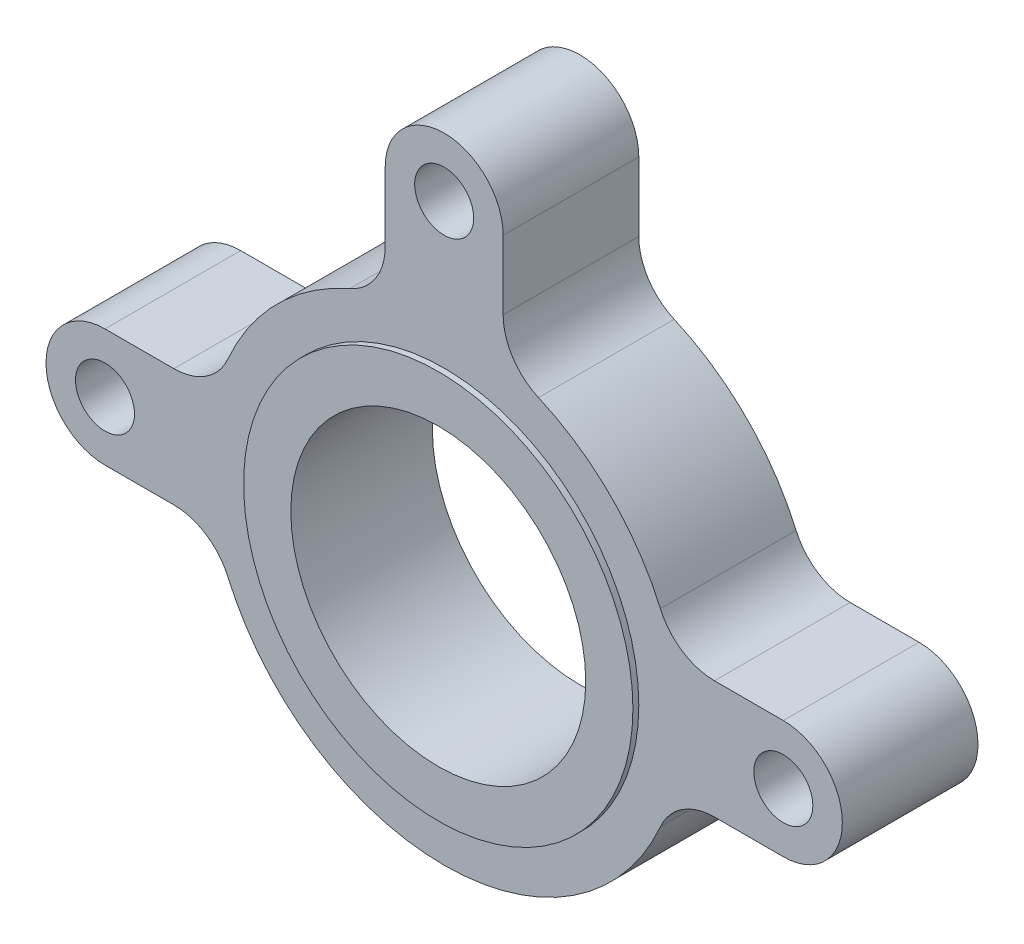
ISO-10303-21;
HEADER;
FILE_DESCRIPTION(('STEP AP214'),'2;1');
FILE_NAME('part.step','',(''),(''),'','','');
FILE_SCHEMA(('AUTOMOTIVE_DESIGN { 1 0 10303 214 1 1 1 1 }'));
ENDSEC;
DATA;
#1=APPLICATION_CONTEXT('core data for automotive mechanical design processes');
#2=APPLICATION_PROTOCOL_DEFINITION('international standard','automotive_design',2000,#1);
#3=PRODUCT_CONTEXT('',#1,'mechanical');
#4=PRODUCT('Part','Part','',(#3));
#5=PRODUCT_RELATED_PRODUCT_CATEGORY('part','',(#4));
#6=PRODUCT_DEFINITION_FORMATION('','',#4);
#7=PRODUCT_DEFINITION_CONTEXT('part definition',#1,'design');
#8=PRODUCT_DEFINITION('design','',#6,#7);
#9=PRODUCT_DEFINITION_SHAPE('','',#8);
#10=(LENGTH_UNIT() NAMED_UNIT(*) SI_UNIT(.MILLI.,.METRE.));
#11=(NAMED_UNIT(*) PLANE_ANGLE_UNIT() SI_UNIT($,.RADIAN.));
#12=(NAMED_UNIT(*) SI_UNIT($,.STERADIAN.) SOLID_ANGLE_UNIT());
#13=UNCERTAINTY_MEASURE_WITH_UNIT(LENGTH_MEASURE(1.E-05),#10,'distance_accuracy_value','');
#14=(GEOMETRIC_REPRESENTATION_CONTEXT(3) GLOBAL_UNCERTAINTY_ASSIGNED_CONTEXT((#13)) GLOBAL_UNIT_ASSIGNED_CONTEXT((#10,
#11,#12)) REPRESENTATION_CONTEXT('',''));
#15=CARTESIAN_POINT('',(0.,0.,0.));
#16=DIRECTION('',(0.,0.,1.));
#17=DIRECTION('',(1.,0.,0.));
#18=AXIS2_PLACEMENT_3D('',#15,#16,#17);
#19=CARTESIAN_POINT('',(0.,0.,11.5));
#20=DIRECTION('',(0.,0.,-1.));
#21=DIRECTION('',(-1.,0.,0.));
#22=AXIS2_PLACEMENT_3D('',#19,#20,#21);
#23=CYLINDRICAL_SURFACE('',#22,20.0000000000001);
#24=CARTESIAN_POINT('',(0.,0.,0.));
#25=DIRECTION('',(0.,0.,1.));
#26=DIRECTION('',(1.,0.,0.));
#27=AXIS2_PLACEMENT_3D('',#24,#25,#26);
#28=CIRCLE('',#27,20.0000000000001);
#29=CARTESIAN_POINT('',(18.3303027798234,8.00000000000005,0.));
#30=VERTEX_POINT('',#29);
#31=CARTESIAN_POINT('',(8.00000000000007,18.3303027798234,0.));
#32=VERTEX_POINT('',#31);
#33=EDGE_CURVE('E210',#30,#32,#28,.T.);
#34=ORIENTED_EDGE('',*,*,#33,.T.);
#35=DIRECTION('',(0.,0.,-1.));
#36=VECTOR('',#35,1.);
#37=CARTESIAN_POINT('',(8.00000000000007,18.3303027798234,11.5));
#38=LINE('',#37,#36);
#39=CARTESIAN_POINT('',(8.00000000000007,18.3303027798234,11.5));
#40=VERTEX_POINT('',#39);
#41=EDGE_CURVE('E11',#40,#32,#38,.T.);
#42=ORIENTED_EDGE('',*,*,#41,.F.);
#43=CARTESIAN_POINT('',(0.,0.,11.5));
#44=DIRECTION('',(0.,0.,1.));
#45=DIRECTION('',(1.,0.,0.));
#46=AXIS2_PLACEMENT_3D('',#43,#44,#45);
#47=CIRCLE('',#46,20.0000000000001);
#48=CARTESIAN_POINT('',(18.3303027798234,8.00000000000005,11.5));
#49=VERTEX_POINT('',#48);
#50=EDGE_CURVE('E341',#49,#40,#47,.T.);
#51=ORIENTED_EDGE('',*,*,#50,.F.);
#52=DIRECTION('',(0.,0.,-1.));
#53=VECTOR('',#52,1.);
#54=CARTESIAN_POINT('',(18.3303027798234,8.00000000000005,11.5));
#55=LINE('',#54,#53);
#56=EDGE_CURVE('E196',#49,#30,#55,.T.);
#57=ORIENTED_EDGE('',*,*,#56,.T.);
#58=EDGE_LOOP('',(#34,#42,#51,#57));
#59=FACE_BOUND('',#58,.T.);
#60=ADVANCED_FACE('F43',(#59),#23,.T.);
#61=CARTESIAN_POINT('',(10.0000000000001,22.9128784747792,11.5));
#62=DIRECTION('',(0.,0.,-1.));
#63=DIRECTION('',(-1.,0.,0.));
#64=AXIS2_PLACEMENT_3D('',#61,#62,#63);
#65=CYLINDRICAL_SURFACE('',#64,5.);
#66=CARTESIAN_POINT('',(10.0000000000001,22.9128784747792,0.));
#67=DIRECTION('',(0.,0.,1.));
#68=DIRECTION('',(1.,0.,0.));
#69=AXIS2_PLACEMENT_3D('',#66,#67,#68);
#70=CIRCLE('',#69,5.);
#71=CARTESIAN_POINT('',(5.00000000000006,22.9128784747792,0.));
#72=VERTEX_POINT('',#71);
#73=EDGE_CURVE('E213',#32,#72,#70,.F.);
#74=ORIENTED_EDGE('',*,*,#73,.T.);
#75=DIRECTION('',(0.,0.,-1.));
#76=VECTOR('',#75,1.);
#77=CARTESIAN_POINT('',(5.00000000000006,22.9128784747792,11.5));
#78=LINE('',#77,#76);
#79=CARTESIAN_POINT('',(5.00000000000006,22.9128784747792,11.5));
#80=VERTEX_POINT('',#79);
#81=EDGE_CURVE('E52',#80,#72,#78,.T.);
#82=ORIENTED_EDGE('',*,*,#81,.F.);
#83=CARTESIAN_POINT('',(10.0000000000001,22.9128784747792,11.5));
#84=DIRECTION('',(0.,0.,1.));
#85=DIRECTION('',(1.,0.,0.));
#86=AXIS2_PLACEMENT_3D('',#83,#84,#85);
#87=CIRCLE('',#86,5.);
#88=EDGE_CURVE('E133',#40,#80,#87,.F.);
#89=ORIENTED_EDGE('',*,*,#88,.F.);
#90=ORIENTED_EDGE('',*,*,#41,.T.);
#91=EDGE_LOOP('',(#74,#82,#89,#90));
#92=FACE_BOUND('',#91,.T.);
#93=ADVANCED_FACE('F291',(#92),#65,.F.);
#94=CARTESIAN_POINT('',(5.00000000000006,0.,11.5));
#95=DIRECTION('',(1.,0.,0.));
#96=DIRECTION('',(0.,0.,-1.));
#97=AXIS2_PLACEMENT_3D('',#94,#95,#96);
#98=PLANE('',#97);
#99=DIRECTION('',(0.,-1.,0.));
#100=VECTOR('',#99,1.);
#101=CARTESIAN_POINT('',(5.00000000000006,0.,0.));
#102=LINE('',#101,#100);
#103=CARTESIAN_POINT('',(5.00000000000006,28.75,0.));
#104=VERTEX_POINT('',#103);
#105=EDGE_CURVE('E216',#104,#72,#102,.T.);
#106=ORIENTED_EDGE('',*,*,#105,.F.);
#107=DIRECTION('',(0.,0.,-1.));
#108=VECTOR('',#107,1.);
#109=CARTESIAN_POINT('',(5.00000000000006,28.75,11.5));
#110=LINE('',#109,#108);
#111=CARTESIAN_POINT('',(5.00000000000006,28.75,11.5));
#112=VERTEX_POINT('',#111);
#113=EDGE_CURVE('E284',#112,#104,#110,.T.);
#114=ORIENTED_EDGE('',*,*,#113,.F.);
#115=DIRECTION('',(0.,-1.,0.));
#116=VECTOR('',#115,1.);
#117=CARTESIAN_POINT('',(5.00000000000006,0.,11.5));
#118=LINE('',#117,#116);
#119=EDGE_CURVE('E290',#112,#80,#118,.T.);
#120=ORIENTED_EDGE('',*,*,#119,.T.);
#121=ORIENTED_EDGE('',*,*,#81,.T.);
#122=EDGE_LOOP('',(#106,#114,#120,#121));
#123=FACE_BOUND('',#122,.T.);
#124=ADVANCED_FACE('F288',(#123),#98,.T.);
#125=CARTESIAN_POINT('',(0.,28.75,11.5));
#126=DIRECTION('',(0.,0.,-1.));
#127=DIRECTION('',(-1.,0.,0.));
#128=AXIS2_PLACEMENT_3D('',#125,#126,#127);
#129=CYLINDRICAL_SURFACE('',#128,5.);
#130=CARTESIAN_POINT('',(0.,28.75,0.));
#131=DIRECTION('',(0.,0.,1.));
#132=DIRECTION('',(1.,0.,0.));
#133=AXIS2_PLACEMENT_3D('',#130,#131,#132);
#134=CIRCLE('',#133,5.);
#135=CARTESIAN_POINT('',(-4.99999999999994,28.75,0.));
#136=VERTEX_POINT('',#135);
#137=EDGE_CURVE('E219',#104,#136,#134,.T.);
#138=ORIENTED_EDGE('',*,*,#137,.T.);
#139=DIRECTION('',(0.,0.,-1.));
#140=VECTOR('',#139,1.);
#141=CARTESIAN_POINT('',(-4.99999999999994,28.75,11.5));
#142=LINE('',#141,#140);
#143=CARTESIAN_POINT('',(-4.99999999999994,28.75,11.5));
#144=VERTEX_POINT('',#143);
#145=EDGE_CURVE('E281',#144,#136,#142,.T.);
#146=ORIENTED_EDGE('',*,*,#145,.F.);
#147=CARTESIAN_POINT('',(0.,28.75,11.5));
#148=DIRECTION('',(0.,0.,1.));
#149=DIRECTION('',(1.,0.,0.));
#150=AXIS2_PLACEMENT_3D('',#147,#148,#149);
#151=CIRCLE('',#150,5.);
#152=EDGE_CURVE('E311',#112,#144,#151,.T.);
#153=ORIENTED_EDGE('',*,*,#152,.F.);
#154=ORIENTED_EDGE('',*,*,#113,.T.);
#155=EDGE_LOOP('',(#138,#146,#153,#154));
#156=FACE_BOUND('',#155,.T.);
#157=ADVANCED_FACE('F302',(#156),#129,.T.);
#158=CARTESIAN_POINT('',(-4.99999999999994,0.,11.5));
#159=DIRECTION('',(1.,0.,0.));
#160=DIRECTION('',(0.,0.,-1.));
#161=AXIS2_PLACEMENT_3D('',#158,#159,#160);
#162=PLANE('',#161);
#163=DIRECTION('',(0.,-1.,0.));
#164=VECTOR('',#163,1.);
#165=CARTESIAN_POINT('',(-4.99999999999994,0.,0.));
#166=LINE('',#165,#164);
#167=CARTESIAN_POINT('',(-4.99999999999994,22.9128784747792,0.));
#168=VERTEX_POINT('',#167);
#169=EDGE_CURVE('E221',#136,#168,#166,.T.);
#170=ORIENTED_EDGE('',*,*,#169,.T.);
#171=DIRECTION('',(0.,0.,-1.));
#172=VECTOR('',#171,1.);
#173=CARTESIAN_POINT('',(-4.99999999999994,22.9128784747792,11.5));
#174=LINE('',#173,#172);
#175=CARTESIAN_POINT('',(-4.99999999999994,22.9128784747792,11.5));
#176=VERTEX_POINT('',#175);
#177=EDGE_CURVE('E278',#176,#168,#174,.T.);
#178=ORIENTED_EDGE('',*,*,#177,.F.);
#179=DIRECTION('',(0.,-1.,0.));
#180=VECTOR('',#179,1.);
#181=CARTESIAN_POINT('',(-4.99999999999994,0.,11.5));
#182=LINE('',#181,#180);
#183=EDGE_CURVE('E308',#144,#176,#182,.T.);
#184=ORIENTED_EDGE('',*,*,#183,.F.);
#185=ORIENTED_EDGE('',*,*,#145,.T.);
#186=EDGE_LOOP('',(#170,#178,#184,#185));
#187=FACE_BOUND('',#186,.T.);
#188=ADVANCED_FACE('F306',(#187),#162,.F.);
#189=CARTESIAN_POINT('',(-9.99999999999994,22.9128784747792,11.5));
#190=DIRECTION('',(0.,0.,-1.));
#191=DIRECTION('',(-1.,0.,0.));
#192=AXIS2_PLACEMENT_3D('',#189,#190,#191);
#193=CYLINDRICAL_SURFACE('',#192,5.);
#194=CARTESIAN_POINT('',(-9.99999999999994,22.9128784747792,0.));
#195=DIRECTION('',(0.,0.,1.));
#196=DIRECTION('',(1.,0.,0.));
#197=AXIS2_PLACEMENT_3D('',#194,#195,#196);
#198=CIRCLE('',#197,5.);
#199=CARTESIAN_POINT('',(-7.99999999999994,18.3303027798233,0.));
#200=VERTEX_POINT('',#199);
#201=EDGE_CURVE('E223',#168,#200,#198,.F.);
#202=ORIENTED_EDGE('',*,*,#201,.T.);
#203=DIRECTION('',(0.,0.,-1.));
#204=VECTOR('',#203,1.);
#205=CARTESIAN_POINT('',(-7.99999999999994,18.3303027798233,11.5));
#206=LINE('',#205,#204);
#207=CARTESIAN_POINT('',(-7.99999999999994,18.3303027798233,11.5));
#208=VERTEX_POINT('',#207);
#209=EDGE_CURVE('E275',#208,#200,#206,.T.);
#210=ORIENTED_EDGE('',*,*,#209,.F.);
#211=CARTESIAN_POINT('',(-9.99999999999994,22.9128784747792,11.5));
#212=DIRECTION('',(0.,0.,1.));
#213=DIRECTION('',(1.,0.,0.));
#214=AXIS2_PLACEMENT_3D('',#211,#212,#213);
#215=CIRCLE('',#214,5.);
#216=EDGE_CURVE('E310',#176,#208,#215,.F.);
#217=ORIENTED_EDGE('',*,*,#216,.F.);
#218=ORIENTED_EDGE('',*,*,#177,.T.);
#219=EDGE_LOOP('',(#202,#210,#217,#218));
#220=FACE_BOUND('',#219,.T.);
#221=ADVANCED_FACE('F577',(#220),#193,.F.);
#222=CARTESIAN_POINT('',(0.,0.,11.5));
#223=DIRECTION('',(0.,0.,-1.));
#224=DIRECTION('',(-1.,0.,0.));
#225=AXIS2_PLACEMENT_3D('',#222,#223,#224);
#226=CYLINDRICAL_SURFACE('',#225,19.9999999999999);
#227=CARTESIAN_POINT('',(0.,0.,0.));
#228=DIRECTION('',(0.,0.,1.));
#229=DIRECTION('',(1.,0.,0.));
#230=AXIS2_PLACEMENT_3D('',#227,#228,#229);
#231=CIRCLE('',#230,19.9999999999999);
#232=CARTESIAN_POINT('',(-18.3303027798233,8.00000000000006,0.));
#233=VERTEX_POINT('',#232);
#234=EDGE_CURVE('E225',#200,#233,#231,.T.);
#235=ORIENTED_EDGE('',*,*,#234,.T.);
#236=DIRECTION('',(0.,0.,-1.));
#237=VECTOR('',#236,1.);
#238=CARTESIAN_POINT('',(-18.3303027798233,8.00000000000006,11.5));
#239=LINE('',#238,#237);
#240=CARTESIAN_POINT('',(-18.3303027798233,8.00000000000006,11.5));
#241=VERTEX_POINT('',#240);
#242=EDGE_CURVE('E273',#241,#233,#239,.T.);
#243=ORIENTED_EDGE('',*,*,#242,.F.);
#244=CARTESIAN_POINT('',(0.,0.,11.5));
#245=DIRECTION('',(0.,0.,1.));
#246=DIRECTION('',(1.,0.,0.));
#247=AXIS2_PLACEMENT_3D('',#244,#245,#246);
#248=CIRCLE('',#247,19.9999999999999);
#249=EDGE_CURVE('E313',#208,#241,#248,.T.);
#250=ORIENTED_EDGE('',*,*,#249,.F.);
#251=ORIENTED_EDGE('',*,*,#209,.T.);
#252=EDGE_LOOP('',(#235,#243,#250,#251));
#253=FACE_BOUND('',#252,.T.);
#254=ADVANCED_FACE('F567',(#253),#226,.T.);
#255=CARTESIAN_POINT('',(-22.9128784747791,10.0000000000001,11.5));
#256=DIRECTION('',(0.,0.,-1.));
#257=DIRECTION('',(-1.,0.,0.));
#258=AXIS2_PLACEMENT_3D('',#255,#256,#257);
#259=CYLINDRICAL_SURFACE('',#258,5.);
#260=CARTESIAN_POINT('',(-22.9128784747791,10.0000000000001,0.));
#261=DIRECTION('',(0.,0.,1.));
#262=DIRECTION('',(1.,0.,0.));
#263=AXIS2_PLACEMENT_3D('',#260,#261,#262);
#264=CIRCLE('',#263,5.);
#265=CARTESIAN_POINT('',(-22.9128784747791,5.00000000000006,0.));
#266=VERTEX_POINT('',#265);
#267=EDGE_CURVE('E228',#266,#233,#264,.T.);
#268=ORIENTED_EDGE('',*,*,#267,.F.);
#269=DIRECTION('',(0.,0.,-1.));
#270=VECTOR('',#269,1.);
#271=CARTESIAN_POINT('',(-22.9128784747791,5.00000000000006,11.5));
#272=LINE('',#271,#270);
#273=CARTESIAN_POINT('',(-22.9128784747791,5.00000000000006,11.5));
#274=VERTEX_POINT('',#273);
#275=EDGE_CURVE('E271',#274,#266,#272,.T.);
#276=ORIENTED_EDGE('',*,*,#275,.F.);
#277=CARTESIAN_POINT('',(-22.9128784747791,10.0000000000001,11.5));
#278=DIRECTION('',(0.,0.,1.));
#279=DIRECTION('',(1.,0.,0.));
#280=AXIS2_PLACEMENT_3D('',#277,#278,#279);
#281=CIRCLE('',#280,5.);
#282=EDGE_CURVE('E319',#274,#241,#281,.T.);
#283=ORIENTED_EDGE('',*,*,#282,.T.);
#284=ORIENTED_EDGE('',*,*,#242,.T.);
#285=EDGE_LOOP('',(#268,#276,#283,#284));
#286=FACE_BOUND('',#285,.T.);
#287=ADVANCED_FACE('F557',(#286),#259,.F.);
#288=CARTESIAN_POINT('',(0.,5.00000000000007,11.5));
#289=DIRECTION('',(0.,1.,0.));
#290=DIRECTION('',(-1.,0.,0.));
#291=AXIS2_PLACEMENT_3D('',#288,#289,#290);
#292=PLANE('',#291);
#293=DIRECTION('',(1.,0.,0.));
#294=VECTOR('',#293,1.);
#295=CARTESIAN_POINT('',(0.,5.00000000000007,0.));
#296=LINE('',#295,#294);
#297=CARTESIAN_POINT('',(-28.7499999999999,5.00000000000006,0.));
#298=VERTEX_POINT('',#297);
#299=EDGE_CURVE('E231',#298,#266,#296,.T.);
#300=ORIENTED_EDGE('',*,*,#299,.F.);
#301=DIRECTION('',(0.,0.,-1.));
#302=VECTOR('',#301,1.);
#303=CARTESIAN_POINT('',(-28.7499999999999,5.00000000000006,11.5));
#304=LINE('',#303,#302);
#305=CARTESIAN_POINT('',(-28.7499999999999,5.00000000000006,11.5));
#306=VERTEX_POINT('',#305);
#307=EDGE_CURVE('E269',#306,#298,#304,.T.);
#308=ORIENTED_EDGE('',*,*,#307,.F.);
#309=DIRECTION('',(1.,0.,0.));
#310=VECTOR('',#309,1.);
#311=CARTESIAN_POINT('',(0.,5.00000000000007,11.5));
#312=LINE('',#311,#310);
#313=EDGE_CURVE('E322',#306,#274,#312,.T.);
#314=ORIENTED_EDGE('',*,*,#313,.T.);
#315=ORIENTED_EDGE('',*,*,#275,.T.);
#316=EDGE_LOOP('',(#300,#308,#314,#315));
#317=FACE_BOUND('',#316,.T.);
#318=ADVANCED_FACE('F547',(#317),#292,.T.);
#319=CARTESIAN_POINT('',(-28.7499999999999,0.,11.5));
#320=DIRECTION('',(0.,0.,-1.));
#321=DIRECTION('',(-1.,0.,0.));
#322=AXIS2_PLACEMENT_3D('',#319,#320,#321);
#323=CYLINDRICAL_SURFACE('',#322,5.00000000000007);
#324=CARTESIAN_POINT('',(-28.7499999999999,0.,0.));
#325=DIRECTION('',(0.,0.,1.));
#326=DIRECTION('',(1.,0.,0.));
#327=AXIS2_PLACEMENT_3D('',#324,#325,#326);
#328=CIRCLE('',#327,5.00000000000007);
#329=CARTESIAN_POINT('',(-28.7499999999999,-5.00000000000008,0.));
#330=VERTEX_POINT('',#329);
#331=EDGE_CURVE('E234',#298,#330,#328,.T.);
#332=ORIENTED_EDGE('',*,*,#331,.T.);
#333=DIRECTION('',(0.,0.,-1.));
#334=VECTOR('',#333,1.);
#335=CARTESIAN_POINT('',(-28.7499999999999,-5.00000000000008,11.5));
#336=LINE('',#335,#334);
#337=CARTESIAN_POINT('',(-28.7499999999999,-5.00000000000008,11.5));
#338=VERTEX_POINT('',#337);
#339=EDGE_CURVE('E266',#338,#330,#336,.T.);
#340=ORIENTED_EDGE('',*,*,#339,.F.);
#341=CARTESIAN_POINT('',(-28.7499999999999,0.,11.5));
#342=DIRECTION('',(0.,0.,1.));
#343=DIRECTION('',(1.,0.,0.));
#344=AXIS2_PLACEMENT_3D('',#341,#342,#343);
#345=CIRCLE('',#344,5.00000000000007);
#346=EDGE_CURVE('E325',#306,#338,#345,.T.);
#347=ORIENTED_EDGE('',*,*,#346,.F.);
#348=ORIENTED_EDGE('',*,*,#307,.T.);
#349=EDGE_LOOP('',(#332,#340,#347,#348));
#350=FACE_BOUND('',#349,.T.);
#351=ADVANCED_FACE('F537',(#350),#323,.T.);
#352=CARTESIAN_POINT('',(0.,-5.00000000000005,11.5));
#353=DIRECTION('',(0.,1.,0.));
#354=DIRECTION('',(-1.,0.,0.));
#355=AXIS2_PLACEMENT_3D('',#352,#353,#354);
#356=PLANE('',#355);
#357=DIRECTION('',(1.,0.,0.));
#358=VECTOR('',#357,1.);
#359=CARTESIAN_POINT('',(0.,-5.00000000000005,0.));
#360=LINE('',#359,#358);
#361=CARTESIAN_POINT('',(-22.9128784747791,-5.00000000000008,0.));
#362=VERTEX_POINT('',#361);
#363=EDGE_CURVE('E236',#330,#362,#360,.T.);
#364=ORIENTED_EDGE('',*,*,#363,.T.);
#365=DIRECTION('',(0.,0.,-1.));
#366=VECTOR('',#365,1.);
#367=CARTESIAN_POINT('',(-22.9128784747791,-5.00000000000008,11.5));
#368=LINE('',#367,#366);
#369=CARTESIAN_POINT('',(-22.9128784747791,-5.00000000000008,11.5));
#370=VERTEX_POINT('',#369);
#371=EDGE_CURVE('E263',#370,#362,#368,.T.);
#372=ORIENTED_EDGE('',*,*,#371,.F.);
#373=DIRECTION('',(1.,0.,0.));
#374=VECTOR('',#373,1.);
#375=CARTESIAN_POINT('',(0.,-5.00000000000005,11.5));
#376=LINE('',#375,#374);
#377=EDGE_CURVE('E327',#338,#370,#376,.T.);
#378=ORIENTED_EDGE('',*,*,#377,.F.);
#379=ORIENTED_EDGE('',*,*,#339,.T.);
#380=EDGE_LOOP('',(#364,#372,#378,#379));
#381=FACE_BOUND('',#380,.T.);
#382=ADVANCED_FACE('F527',(#381),#356,.F.);
#383=CARTESIAN_POINT('',(-22.9128784747791,-10.0000000000001,11.5));
#384=DIRECTION('',(0.,0.,-1.));
#385=DIRECTION('',(-1.,0.,0.));
#386=AXIS2_PLACEMENT_3D('',#383,#384,#385);
#387=CYLINDRICAL_SURFACE('',#386,5.);
#388=CARTESIAN_POINT('',(-22.9128784747791,-10.0000000000001,0.));
#389=DIRECTION('',(0.,0.,1.));
#390=DIRECTION('',(1.,0.,0.));
#391=AXIS2_PLACEMENT_3D('',#388,#389,#390);
#392=CIRCLE('',#391,5.);
#393=CARTESIAN_POINT('',(-18.3303027798233,-8.00000000000009,0.));
#394=VERTEX_POINT('',#393);
#395=EDGE_CURVE('E238',#362,#394,#392,.F.);
#396=ORIENTED_EDGE('',*,*,#395,.T.);
#397=DIRECTION('',(0.,0.,-1.));
#398=VECTOR('',#397,1.);
#399=CARTESIAN_POINT('',(-18.3303027798233,-8.00000000000009,11.5));
#400=LINE('',#399,#398);
#401=CARTESIAN_POINT('',(-18.3303027798233,-8.00000000000009,11.5));
#402=VERTEX_POINT('',#401);
#403=EDGE_CURVE('E260',#402,#394,#400,.T.);
#404=ORIENTED_EDGE('',*,*,#403,.F.);
#405=CARTESIAN_POINT('',(-22.9128784747791,-10.0000000000001,11.5));
#406=DIRECTION('',(0.,0.,1.));
#407=DIRECTION('',(1.,0.,0.));
#408=AXIS2_PLACEMENT_3D('',#405,#406,#407);
#409=CIRCLE('',#408,5.);
#410=EDGE_CURVE('E329',#370,#402,#409,.F.);
#411=ORIENTED_EDGE('',*,*,#410,.F.);
#412=ORIENTED_EDGE('',*,*,#371,.T.);
#413=EDGE_LOOP('',(#396,#404,#411,#412));
#414=FACE_BOUND('',#413,.T.);
#415=ADVANCED_FACE('F517',(#414),#387,.F.);
#416=CARTESIAN_POINT('',(0.,0.,11.5));
#417=DIRECTION('',(0.,0.,-1.));
#418=DIRECTION('',(-1.,0.,0.));
#419=AXIS2_PLACEMENT_3D('',#416,#417,#418);
#420=CYLINDRICAL_SURFACE('',#419,20.);
#421=CARTESIAN_POINT('',(0.,0.,0.));
#422=DIRECTION('',(0.,0.,1.));
#423=DIRECTION('',(1.,0.,0.));
#424=AXIS2_PLACEMENT_3D('',#421,#422,#423);
#425=CIRCLE('',#424,20.);
#426=CARTESIAN_POINT('',(18.3303027798234,-8.00000000000002,0.));
#427=VERTEX_POINT('',#426);
#428=EDGE_CURVE('E240',#394,#427,#425,.T.);
#429=ORIENTED_EDGE('',*,*,#428,.T.);
#430=DIRECTION('',(0.,0.,-1.));
#431=VECTOR('',#430,1.);
#432=CARTESIAN_POINT('',(18.3303027798234,-8.00000000000002,11.5));
#433=LINE('',#432,#431);
#434=CARTESIAN_POINT('',(18.3303027798234,-8.00000000000002,11.5));
#435=VERTEX_POINT('',#434);
#436=EDGE_CURVE('E258',#435,#427,#433,.T.);
#437=ORIENTED_EDGE('',*,*,#436,.F.);
#438=CARTESIAN_POINT('',(0.,0.,11.5));
#439=DIRECTION('',(0.,0.,1.));
#440=DIRECTION('',(1.,0.,0.));
#441=AXIS2_PLACEMENT_3D('',#438,#439,#440);
#442=CIRCLE('',#441,20.);
#443=EDGE_CURVE('E331',#402,#435,#442,.T.);
#444=ORIENTED_EDGE('',*,*,#443,.F.);
#445=ORIENTED_EDGE('',*,*,#403,.T.);
#446=EDGE_LOOP('',(#429,#437,#444,#445));
#447=FACE_BOUND('',#446,.T.);
#448=ADVANCED_FACE('F507',(#447),#420,.T.);
#449=CARTESIAN_POINT('',(22.9128784747793,-10.0000000000001,11.5));
#450=DIRECTION('',(0.,0.,-1.));
#451=DIRECTION('',(-1.,0.,0.));
#452=AXIS2_PLACEMENT_3D('',#449,#450,#451);
#453=CYLINDRICAL_SURFACE('',#452,5.);
#454=CARTESIAN_POINT('',(22.9128784747793,-10.0000000000001,0.));
#455=DIRECTION('',(0.,0.,1.));
#456=DIRECTION('',(1.,0.,0.));
#457=AXIS2_PLACEMENT_3D('',#454,#455,#456);
#458=CIRCLE('',#457,5.);
#459=CARTESIAN_POINT('',(22.9128784747793,-5.00000000000006,0.));
#460=VERTEX_POINT('',#459);
#461=EDGE_CURVE('E243',#460,#427,#458,.T.);
#462=ORIENTED_EDGE('',*,*,#461,.F.);
#463=DIRECTION('',(0.,0.,-1.));
#464=VECTOR('',#463,1.);
#465=CARTESIAN_POINT('',(22.9128784747793,-5.00000000000006,11.5));
#466=LINE('',#465,#464);
#467=CARTESIAN_POINT('',(22.9128784747793,-5.00000000000006,11.5));
#468=VERTEX_POINT('',#467);
#469=EDGE_CURVE('E256',#468,#460,#466,.T.);
#470=ORIENTED_EDGE('',*,*,#469,.F.);
#471=CARTESIAN_POINT('',(22.9128784747793,-10.0000000000001,11.5));
#472=DIRECTION('',(0.,0.,1.));
#473=DIRECTION('',(1.,0.,0.));
#474=AXIS2_PLACEMENT_3D('',#471,#472,#473);
#475=CIRCLE('',#474,5.);
#476=EDGE_CURVE('E333',#468,#435,#475,.T.);
#477=ORIENTED_EDGE('',*,*,#476,.T.);
#478=ORIENTED_EDGE('',*,*,#436,.T.);
#479=EDGE_LOOP('',(#462,#470,#477,#478));
#480=FACE_BOUND('',#479,.T.);
#481=ADVANCED_FACE('F498',(#480),#453,.F.);
#482=CARTESIAN_POINT('',(0.,-5.00000000000006,11.5));
#483=DIRECTION('',(0.,-1.,0.));
#484=DIRECTION('',(1.,0.,0.));
#485=AXIS2_PLACEMENT_3D('',#482,#483,#484);
#486=PLANE('',#485);
#487=DIRECTION('',(-1.,0.,0.));
#488=VECTOR('',#487,1.);
#489=CARTESIAN_POINT('',(0.,-5.00000000000006,0.));
#490=LINE('',#489,#488);
#491=CARTESIAN_POINT('',(28.7500000000001,-5.00000000000006,0.));
#492=VERTEX_POINT('',#491);
#493=EDGE_CURVE('E246',#492,#460,#490,.T.);
#494=ORIENTED_EDGE('',*,*,#493,.F.);
#495=DIRECTION('',(0.,0.,-1.));
#496=VECTOR('',#495,1.);
#497=CARTESIAN_POINT('',(28.7500000000001,-5.00000000000006,11.5));
#498=LINE('',#497,#496);
#499=CARTESIAN_POINT('',(28.7500000000001,-5.00000000000006,11.5));
#500=VERTEX_POINT('',#499);
#501=EDGE_CURVE('E191',#500,#492,#498,.T.);
#502=ORIENTED_EDGE('',*,*,#501,.F.);
#503=DIRECTION('',(-1.,0.,0.));
#504=VECTOR('',#503,1.);
#505=CARTESIAN_POINT('',(0.,-5.00000000000006,11.5));
#506=LINE('',#505,#504);
#507=EDGE_CURVE('E184',#500,#468,#506,.T.);
#508=ORIENTED_EDGE('',*,*,#507,.T.);
#509=ORIENTED_EDGE('',*,*,#469,.T.);
#510=EDGE_LOOP('',(#494,#502,#508,#509));
#511=FACE_BOUND('',#510,.T.);
#512=ADVANCED_FACE('F337',(#511),#486,.T.);
#513=CARTESIAN_POINT('',(28.7500000000001,0.,11.5));
#514=DIRECTION('',(0.,0.,-1.));
#515=DIRECTION('',(-1.,0.,0.));
#516=AXIS2_PLACEMENT_3D('',#513,#514,#515);
#517=CYLINDRICAL_SURFACE('',#516,5.00000000000007);
#518=CARTESIAN_POINT('',(28.7500000000001,0.,0.));
#519=DIRECTION('',(0.,0.,1.));
#520=DIRECTION('',(1.,0.,0.));
#521=AXIS2_PLACEMENT_3D('',#518,#519,#520);
#522=CIRCLE('',#521,5.00000000000007);
#523=CARTESIAN_POINT('',(28.7500000000001,5.00000000000008,0.));
#524=VERTEX_POINT('',#523);
#525=EDGE_CURVE('E190',#492,#524,#522,.T.);
#526=ORIENTED_EDGE('',*,*,#525,.T.);
#527=DIRECTION('',(0.,0.,-1.));
#528=VECTOR('',#527,1.);
#529=CARTESIAN_POINT('',(28.7500000000001,5.00000000000008,11.5));
#530=LINE('',#529,#528);
#531=CARTESIAN_POINT('',(28.7500000000001,5.00000000000008,11.5));
#532=VERTEX_POINT('',#531);
#533=EDGE_CURVE('E187',#532,#524,#530,.T.);
#534=ORIENTED_EDGE('',*,*,#533,.F.);
#535=CARTESIAN_POINT('',(28.7500000000001,0.,11.5));
#536=DIRECTION('',(0.,0.,1.));
#537=DIRECTION('',(1.,0.,0.));
#538=AXIS2_PLACEMENT_3D('',#535,#536,#537);
#539=CIRCLE('',#538,5.00000000000007);
#540=EDGE_CURVE('E177',#500,#532,#539,.T.);
#541=ORIENTED_EDGE('',*,*,#540,.F.);
#542=ORIENTED_EDGE('',*,*,#501,.T.);
#543=EDGE_LOOP('',(#526,#534,#541,#542));
#544=FACE_BOUND('',#543,.T.);
#545=ADVANCED_FACE('F188',(#544),#517,.T.);
#546=CARTESIAN_POINT('',(0.,5.00000000000007,11.5));
#547=DIRECTION('',(0.,-1.,0.));
#548=DIRECTION('',(1.,0.,0.));
#549=AXIS2_PLACEMENT_3D('',#546,#547,#548);
#550=PLANE('',#549);
#551=DIRECTION('',(-1.,0.,0.));
#552=VECTOR('',#551,1.);
#553=CARTESIAN_POINT('',(0.,5.00000000000007,0.));
#554=LINE('',#553,#552);
#555=CARTESIAN_POINT('',(22.9128784747793,5.00000000000008,0.));
#556=VERTEX_POINT('',#555);
#557=EDGE_CURVE('E119',#524,#556,#554,.T.);
#558=ORIENTED_EDGE('',*,*,#557,.T.);
#559=DIRECTION('',(0.,0.,-1.));
#560=VECTOR('',#559,1.);
#561=CARTESIAN_POINT('',(22.9128784747793,5.00000000000008,11.5));
#562=LINE('',#561,#560);
#563=CARTESIAN_POINT('',(22.9128784747793,5.00000000000008,11.5));
#564=VERTEX_POINT('',#563);
#565=EDGE_CURVE('E192',#564,#556,#562,.T.);
#566=ORIENTED_EDGE('',*,*,#565,.F.);
#567=DIRECTION('',(-1.,0.,0.));
#568=VECTOR('',#567,1.);
#569=CARTESIAN_POINT('',(0.,5.00000000000007,11.5));
#570=LINE('',#569,#568);
#571=EDGE_CURVE('E181',#532,#564,#570,.T.);
#572=ORIENTED_EDGE('',*,*,#571,.F.);
#573=ORIENTED_EDGE('',*,*,#533,.T.);
#574=EDGE_LOOP('',(#558,#566,#572,#573));
#575=FACE_BOUND('',#574,.T.);
#576=ADVANCED_FACE('F194',(#575),#550,.F.);
#577=CARTESIAN_POINT('',(-28.7499999999999,0.,11.5));
#578=DIRECTION('',(0.,0.,-1.));
#579=DIRECTION('',(-1.,0.,0.));
#580=AXIS2_PLACEMENT_3D('',#577,#578,#579);
#581=CYLINDRICAL_SURFACE('',#580,2.50000000000038);
#582=CARTESIAN_POINT('',(-28.7499999999999,0.,11.5));
#583=DIRECTION('',(0.,0.,1.));
#584=DIRECTION('',(1.,0.,0.));
#585=AXIS2_PLACEMENT_3D('',#582,#583,#584);
#586=CIRCLE('',#585,2.50000000000038);
#587=CARTESIAN_POINT('',(-26.2499999999995,0.,11.5));
#588=VERTEX_POINT('',#587);
#589=EDGE_CURVE('E416',#588,#588,#586,.T.);
#590=ORIENTED_EDGE('',*,*,#589,.T.);
#591=EDGE_LOOP('',(#590));
#592=FACE_BOUND('',#591,.T.);
#593=CARTESIAN_POINT('',(-28.7499999999999,0.,0.));
#594=DIRECTION('',(0.,0.,1.));
#595=DIRECTION('',(1.,0.,0.));
#596=AXIS2_PLACEMENT_3D('',#593,#594,#595);
#597=CIRCLE('',#596,2.50000000000038);
#598=CARTESIAN_POINT('',(-26.2499999999995,0.,0.));
#599=VERTEX_POINT('',#598);
#600=EDGE_CURVE('E207',#599,#599,#597,.T.);
#601=ORIENTED_EDGE('',*,*,#600,.F.);
#602=EDGE_LOOP('',(#601));
#603=FACE_BOUND('',#602,.T.);
#604=ADVANCED_FACE('F363',(#592,#603),#581,.F.);
#605=CARTESIAN_POINT('',(28.7500000000001,0.,11.5));
#606=DIRECTION('',(0.,0.,-1.));
#607=DIRECTION('',(-1.,0.,0.));
#608=AXIS2_PLACEMENT_3D('',#605,#606,#607);
#609=CYLINDRICAL_SURFACE('',#608,2.50000000000013);
#610=CARTESIAN_POINT('',(28.7500000000001,0.,11.5));
#611=DIRECTION('',(0.,0.,1.));
#612=DIRECTION('',(1.,0.,0.));
#613=AXIS2_PLACEMENT_3D('',#610,#611,#612);
#614=CIRCLE('',#613,2.50000000000013);
#615=CARTESIAN_POINT('',(31.2500000000002,0.,11.5));
#616=VERTEX_POINT('',#615);
#617=EDGE_CURVE('E373',#616,#616,#614,.T.);
#618=ORIENTED_EDGE('',*,*,#617,.T.);
#619=EDGE_LOOP('',(#618));
#620=FACE_BOUND('',#619,.T.);
#621=CARTESIAN_POINT('',(28.7500000000001,0.,0.));
#622=DIRECTION('',(0.,0.,1.));
#623=DIRECTION('',(1.,0.,0.));
#624=AXIS2_PLACEMENT_3D('',#621,#622,#623);
#625=CIRCLE('',#624,2.50000000000013);
#626=CARTESIAN_POINT('',(31.2500000000002,0.,0.));
#627=VERTEX_POINT('',#626);
#628=EDGE_CURVE('E203',#627,#627,#625,.T.);
#629=ORIENTED_EDGE('',*,*,#628,.F.);
#630=EDGE_LOOP('',(#629));
#631=FACE_BOUND('',#630,.T.);
#632=ADVANCED_FACE('F351',(#620,#631),#609,.F.);
#633=CARTESIAN_POINT('',(0.,28.75,11.5));
#634=DIRECTION('',(0.,0.,-1.));
#635=DIRECTION('',(-1.,0.,0.));
#636=AXIS2_PLACEMENT_3D('',#633,#634,#635);
#637=CYLINDRICAL_SURFACE('',#636,2.5);
#638=CARTESIAN_POINT('',(0.,28.75,11.5));
#639=DIRECTION('',(0.,0.,1.));
#640=DIRECTION('',(1.,0.,0.));
#641=AXIS2_PLACEMENT_3D('',#638,#639,#640);
#642=CIRCLE('',#641,2.5);
#643=CARTESIAN_POINT('',(2.50000000000006,28.75,11.5));
#644=VERTEX_POINT('',#643);
#645=EDGE_CURVE('E412',#644,#644,#642,.T.);
#646=ORIENTED_EDGE('',*,*,#645,.T.);
#647=EDGE_LOOP('',(#646));
#648=FACE_BOUND('',#647,.T.);
#649=CARTESIAN_POINT('',(0.,28.75,0.));
#650=DIRECTION('',(0.,0.,1.));
#651=DIRECTION('',(1.,0.,0.));
#652=AXIS2_PLACEMENT_3D('',#649,#650,#651);
#653=CIRCLE('',#652,2.5);
#654=CARTESIAN_POINT('',(2.50000000000006,28.75,0.));
#655=VERTEX_POINT('',#654);
#656=EDGE_CURVE('E200',#655,#655,#653,.T.);
#657=ORIENTED_EDGE('',*,*,#656,.F.);
#658=EDGE_LOOP('',(#657));
#659=FACE_BOUND('',#658,.T.);
#660=ADVANCED_FACE('F45',(#648,#659),#637,.F.);
#661=CARTESIAN_POINT('',(22.9128784747793,10.0000000000001,11.5));
#662=DIRECTION('',(0.,0.,-1.));
#663=DIRECTION('',(-1.,0.,0.));
#664=AXIS2_PLACEMENT_3D('',#661,#662,#663);
#665=CYLINDRICAL_SURFACE('',#664,5.);
#666=CARTESIAN_POINT('',(22.9128784747793,10.0000000000001,0.));
#667=DIRECTION('',(0.,0.,1.));
#668=DIRECTION('',(1.,0.,0.));
#669=AXIS2_PLACEMENT_3D('',#666,#667,#668);
#670=CIRCLE('',#669,5.);
#671=EDGE_CURVE('E125',#556,#30,#670,.F.);
#672=ORIENTED_EDGE('',*,*,#671,.T.);
#673=ORIENTED_EDGE('',*,*,#56,.F.);
#674=CARTESIAN_POINT('',(22.9128784747793,10.0000000000001,11.5));
#675=DIRECTION('',(0.,0.,1.));
#676=DIRECTION('',(1.,0.,0.));
#677=AXIS2_PLACEMENT_3D('',#674,#675,#676);
#678=CIRCLE('',#677,5.);
#679=EDGE_CURVE('E60',#564,#49,#678,.F.);
#680=ORIENTED_EDGE('',*,*,#679,.F.);
#681=ORIENTED_EDGE('',*,*,#565,.T.);
#682=EDGE_LOOP('',(#672,#673,#680,#681));
#683=FACE_BOUND('',#682,.T.);
#684=ADVANCED_FACE('F342',(#683),#665,.F.);
#685=CARTESIAN_POINT('',(0.,0.,11.5));
#686=DIRECTION('',(0.,0.,1.));
#687=DIRECTION('',(1.,0.,0.));
#688=AXIS2_PLACEMENT_3D('',#685,#686,#687);
#689=PLANE('',#688);
#690=CARTESIAN_POINT('',(0.,0.,11.5));
#691=DIRECTION('',(0.,0.,1.));
#692=DIRECTION('',(1.,0.,0.));
#693=AXIS2_PLACEMENT_3D('',#690,#691,#692);
#694=CIRCLE('',#693,16.5);
#695=CARTESIAN_POINT('',(16.5,0.,11.5));
#696=VERTEX_POINT('',#695);
#697=EDGE_CURVE('E252',#696,#696,#694,.T.);
#698=ORIENTED_EDGE('',*,*,#697,.F.);
#699=EDGE_LOOP('',(#698));
#700=FACE_BOUND('',#699,.T.);
#701=ORIENTED_EDGE('',*,*,#645,.F.);
#702=EDGE_LOOP('',(#701));
#703=FACE_BOUND('',#702,.T.);
#704=ORIENTED_EDGE('',*,*,#617,.F.);
#705=EDGE_LOOP('',(#704));
#706=FACE_BOUND('',#705,.T.);
#707=ORIENTED_EDGE('',*,*,#589,.F.);
#708=EDGE_LOOP('',(#707));
#709=FACE_BOUND('',#708,.T.);
#710=ORIENTED_EDGE('',*,*,#50,.T.);
#711=ORIENTED_EDGE('',*,*,#88,.T.);
#712=ORIENTED_EDGE('',*,*,#119,.F.);
#713=ORIENTED_EDGE('',*,*,#152,.T.);
#714=ORIENTED_EDGE('',*,*,#183,.T.);
#715=ORIENTED_EDGE('',*,*,#216,.T.);
#716=ORIENTED_EDGE('',*,*,#249,.T.);
#717=ORIENTED_EDGE('',*,*,#282,.F.);
#718=ORIENTED_EDGE('',*,*,#313,.F.);
#719=ORIENTED_EDGE('',*,*,#346,.T.);
#720=ORIENTED_EDGE('',*,*,#377,.T.);
#721=ORIENTED_EDGE('',*,*,#410,.T.);
#722=ORIENTED_EDGE('',*,*,#443,.T.);
#723=ORIENTED_EDGE('',*,*,#476,.F.);
#724=ORIENTED_EDGE('',*,*,#507,.F.);
#725=ORIENTED_EDGE('',*,*,#540,.T.);
#726=ORIENTED_EDGE('',*,*,#571,.T.);
#727=ORIENTED_EDGE('',*,*,#679,.T.);
#728=EDGE_LOOP('',(#710,#711,#712,#713,#714,#715,#716,#717,#718,#719,#720,#721,#722,#723,#724,
#725,#726,#727));
#729=FACE_BOUND('',#728,.T.);
#730=ADVANCED_FACE('F179',(#700,#703,#706,#709,#729),#689,.T.);
#731=CARTESIAN_POINT('',(0.,0.,0.));
#732=DIRECTION('',(0.,0.,1.));
#733=DIRECTION('',(1.,0.,0.));
#734=AXIS2_PLACEMENT_3D('',#731,#732,#733);
#735=PLANE('',#734);
#736=ORIENTED_EDGE('',*,*,#656,.T.);
#737=EDGE_LOOP('',(#736));
#738=FACE_BOUND('',#737,.T.);
#739=ORIENTED_EDGE('',*,*,#628,.T.);
#740=EDGE_LOOP('',(#739));
#741=FACE_BOUND('',#740,.T.);
#742=ORIENTED_EDGE('',*,*,#600,.T.);
#743=EDGE_LOOP('',(#742));
#744=FACE_BOUND('',#743,.T.);
#745=ORIENTED_EDGE('',*,*,#33,.F.);
#746=ORIENTED_EDGE('',*,*,#671,.F.);
#747=ORIENTED_EDGE('',*,*,#557,.F.);
#748=ORIENTED_EDGE('',*,*,#525,.F.);
#749=ORIENTED_EDGE('',*,*,#493,.T.);
#750=ORIENTED_EDGE('',*,*,#461,.T.);
#751=ORIENTED_EDGE('',*,*,#428,.F.);
#752=ORIENTED_EDGE('',*,*,#395,.F.);
#753=ORIENTED_EDGE('',*,*,#363,.F.);
#754=ORIENTED_EDGE('',*,*,#331,.F.);
#755=ORIENTED_EDGE('',*,*,#299,.T.);
#756=ORIENTED_EDGE('',*,*,#267,.T.);
#757=ORIENTED_EDGE('',*,*,#234,.F.);
#758=ORIENTED_EDGE('',*,*,#201,.F.);
#759=ORIENTED_EDGE('',*,*,#169,.F.);
#760=ORIENTED_EDGE('',*,*,#137,.F.);
#761=ORIENTED_EDGE('',*,*,#105,.T.);
#762=ORIENTED_EDGE('',*,*,#73,.F.);
#763=EDGE_LOOP('',(#745,#746,#747,#748,#749,#750,#751,#752,#753,#754,#755,#756,#757,#758,#759,
#760,#761,#762));
#764=FACE_BOUND('',#763,.T.);
#765=CARTESIAN_POINT('',(0.,0.,0.));
#766=DIRECTION('',(0.,0.,1.));
#767=DIRECTION('',(1.,0.,0.));
#768=AXIS2_PLACEMENT_3D('',#765,#766,#767);
#769=CIRCLE('',#768,12.5);
#770=CARTESIAN_POINT('',(12.5,0.,0.));
#771=VERTEX_POINT('',#770);
#772=EDGE_CURVE('E405',#771,#771,#769,.T.);
#773=ORIENTED_EDGE('',*,*,#772,.T.);
#774=EDGE_LOOP('',(#773));
#775=FACE_BOUND('',#774,.T.);
#776=ADVANCED_FACE('F296',(#738,#741,#744,#764,#775),#735,.F.);
#777=CARTESIAN_POINT('',(0.,0.,12.));
#778=DIRECTION('',(0.,0.,-1.));
#779=DIRECTION('',(-1.,0.,0.));
#780=AXIS2_PLACEMENT_3D('',#777,#778,#779);
#781=CYLINDRICAL_SURFACE('',#780,12.5);
#782=CARTESIAN_POINT('',(0.,0.,12.));
#783=DIRECTION('',(0.,0.,1.));
#784=DIRECTION('',(1.,0.,0.));
#785=AXIS2_PLACEMENT_3D('',#782,#783,#784);
#786=CIRCLE('',#785,12.5);
#787=CARTESIAN_POINT('',(12.5,0.,12.));
#788=VERTEX_POINT('',#787);
#789=EDGE_CURVE('E400',#788,#788,#786,.T.);
#790=ORIENTED_EDGE('',*,*,#789,.T.);
#791=EDGE_LOOP('',(#790));
#792=FACE_BOUND('',#791,.T.);
#793=ORIENTED_EDGE('',*,*,#772,.F.);
#794=EDGE_LOOP('',(#793));
#795=FACE_BOUND('',#794,.T.);
#796=ADVANCED_FACE('F378',(#792,#795),#781,.F.);
#797=CARTESIAN_POINT('',(0.,0.,12.));
#798=DIRECTION('',(0.,0.,-1.));
#799=DIRECTION('',(-1.,0.,0.));
#800=AXIS2_PLACEMENT_3D('',#797,#798,#799);
#801=CYLINDRICAL_SURFACE('',#800,16.5);
#802=ORIENTED_EDGE('',*,*,#697,.T.);
#803=EDGE_LOOP('',(#802));
#804=FACE_BOUND('',#803,.T.);
#805=CARTESIAN_POINT('',(0.,0.,12.));
#806=DIRECTION('',(0.,0.,1.));
#807=DIRECTION('',(1.,0.,0.));
#808=AXIS2_PLACEMENT_3D('',#805,#806,#807);
#809=CIRCLE('',#808,16.5);
#810=CARTESIAN_POINT('',(16.5,0.,12.));
#811=VERTEX_POINT('',#810);
#812=EDGE_CURVE('E204',#811,#811,#809,.T.);
#813=ORIENTED_EDGE('',*,*,#812,.F.);
#814=EDGE_LOOP('',(#813));
#815=FACE_BOUND('',#814,.T.);
#816=ADVANCED_FACE('F385',(#804,#815),#801,.T.);
#817=CARTESIAN_POINT('',(0.,0.,12.));
#818=DIRECTION('',(0.,0.,1.));
#819=DIRECTION('',(1.,0.,0.));
#820=AXIS2_PLACEMENT_3D('',#817,#818,#819);
#821=PLANE('',#820);
#822=ORIENTED_EDGE('',*,*,#789,.F.);
#823=EDGE_LOOP('',(#822));
#824=FACE_BOUND('',#823,.T.);
#825=ORIENTED_EDGE('',*,*,#812,.T.);
#826=EDGE_LOOP('',(#825));
#827=FACE_BOUND('',#826,.T.);
#828=ADVANCED_FACE('F391',(#824,#827),#821,.T.);
#829=CLOSED_SHELL('',(#60,#93,#124,#157,#188,#221,#254,#287,#318,#351,#382,#415,#448,#481,#512,
#545,#576,#604,#632,#660,#684,#730,#776,#796,#816,#828));
#830=MANIFOLD_SOLID_BREP('B2',#829);
#831=ADVANCED_BREP_SHAPE_REPRESENTATION('',(#18,#830),#14);
#832=SHAPE_DEFINITION_REPRESENTATION(#9,#831);
ENDSEC;
END-ISO-10303-21;
